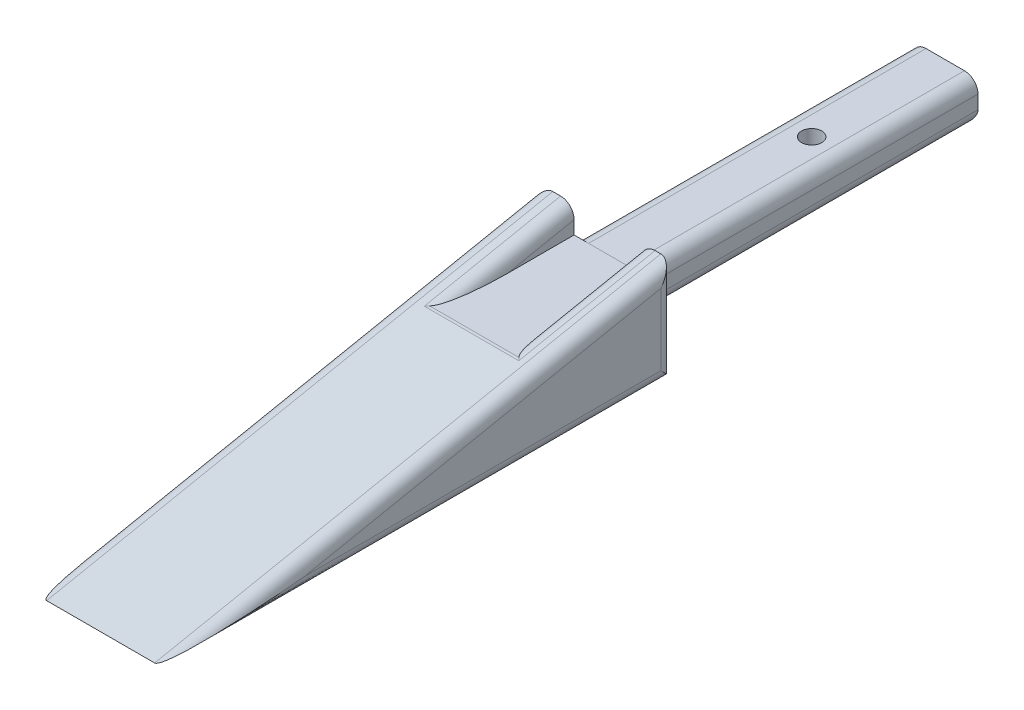
ISO-10303-21;
HEADER;
FILE_DESCRIPTION(('STEP AP214'),'2;1');
FILE_NAME('part.step','',(''),(''),'','','');
FILE_SCHEMA(('AUTOMOTIVE_DESIGN { 1 0 10303 214 1 1 1 1 }'));
ENDSEC;
DATA;
#1=APPLICATION_CONTEXT('core data for automotive mechanical design processes');
#2=APPLICATION_PROTOCOL_DEFINITION('international standard','automotive_design',2000,#1);
#3=PRODUCT_CONTEXT('',#1,'mechanical');
#4=PRODUCT('Part','Part','',(#3));
#5=PRODUCT_RELATED_PRODUCT_CATEGORY('part','',(#4));
#6=PRODUCT_DEFINITION_FORMATION('','',#4);
#7=PRODUCT_DEFINITION_CONTEXT('part definition',#1,'design');
#8=PRODUCT_DEFINITION('design','',#6,#7);
#9=PRODUCT_DEFINITION_SHAPE('','',#8);
#10=(LENGTH_UNIT() NAMED_UNIT(*) SI_UNIT(.MILLI.,.METRE.));
#11=(NAMED_UNIT(*) PLANE_ANGLE_UNIT() SI_UNIT($,.RADIAN.));
#12=(NAMED_UNIT(*) SI_UNIT($,.STERADIAN.) SOLID_ANGLE_UNIT());
#13=UNCERTAINTY_MEASURE_WITH_UNIT(LENGTH_MEASURE(1.E-05),#10,'distance_accuracy_value','');
#14=(GEOMETRIC_REPRESENTATION_CONTEXT(3) GLOBAL_UNCERTAINTY_ASSIGNED_CONTEXT((#13)) GLOBAL_UNIT_ASSIGNED_CONTEXT((#10,
#11,#12)) REPRESENTATION_CONTEXT('',''));
#15=CARTESIAN_POINT('',(0.,0.,0.));
#16=DIRECTION('',(0.,0.,1.));
#17=DIRECTION('',(1.,0.,0.));
#18=AXIS2_PLACEMENT_3D('',#15,#16,#17);
#19=CARTESIAN_POINT('',(-10.15,-8.,125.));
#20=DIRECTION('',(0.,0.98058067569092,0.196116135138184));
#21=DIRECTION('',(0.,-0.196116135138184,0.98058067569092));
#22=AXIS2_PLACEMENT_3D('',#19,#20,#21);
#23=PLANE('',#22);
#24=DIRECTION('',(1.,0.,0.));
#25=VECTOR('',#24,1.);
#26=CARTESIAN_POINT('',(-10.15,7.,50.));
#27=LINE('',#26,#25);
#28=CARTESIAN_POINT('',(-8.15,7.,50.));
#29=VERTEX_POINT('',#28);
#30=CARTESIAN_POINT('',(-7.,7.,50.));
#31=VERTEX_POINT('',#30);
#32=EDGE_CURVE('E163',#29,#31,#27,.T.);
#33=ORIENTED_EDGE('',*,*,#32,.F.);
#34=DIRECTION('',(0.,-0.196116135138184,0.98058067569092));
#35=VECTOR('',#34,1.);
#36=CARTESIAN_POINT('',(-8.15,-8.,125.));
#37=LINE('',#36,#35);
#38=CARTESIAN_POINT('',(-8.15,-8.,125.));
#39=VERTEX_POINT('',#38);
#40=EDGE_CURVE('E173',#29,#39,#37,.T.);
#41=ORIENTED_EDGE('',*,*,#40,.T.);
#42=DIRECTION('',(1.,0.,0.));
#43=VECTOR('',#42,1.);
#44=CARTESIAN_POINT('',(-10.15,-8.,125.));
#45=LINE('',#44,#43);
#46=CARTESIAN_POINT('',(7.85,-8.,125.));
#47=VERTEX_POINT('',#46);
#48=EDGE_CURVE('E245',#39,#47,#45,.T.);
#49=ORIENTED_EDGE('',*,*,#48,.T.);
#50=DIRECTION('',(0.,-0.196116135138184,0.98058067569092));
#51=VECTOR('',#50,1.);
#52=CARTESIAN_POINT('',(7.85,6.99999999999999,50.));
#53=LINE('',#52,#51);
#54=CARTESIAN_POINT('',(7.85,7.,50.));
#55=VERTEX_POINT('',#54);
#56=EDGE_CURVE('E147',#47,#55,#53,.F.);
#57=ORIENTED_EDGE('',*,*,#56,.T.);
#58=CARTESIAN_POINT('',(7.,7.,50.));
#59=VERTEX_POINT('',#58);
#60=EDGE_CURVE('E249',#59,#55,#27,.T.);
#61=ORIENTED_EDGE('',*,*,#60,.F.);
#62=DIRECTION('',(0.,-0.196116135138184,0.98058067569092));
#63=VECTOR('',#62,1.);
#64=CARTESIAN_POINT('',(7.,3.,70.));
#65=LINE('',#64,#63);
#66=CARTESIAN_POINT('',(7.,2.96116135138184,70.1941932430908));
#67=VERTEX_POINT('',#66);
#68=EDGE_CURVE('E168',#59,#67,#65,.T.);
#69=ORIENTED_EDGE('',*,*,#68,.T.);
#70=DIRECTION('',(-1.,0.,0.));
#71=VECTOR('',#70,1.);
#72=CARTESIAN_POINT('',(-5.,2.96116135138184,70.1941932430908));
#73=LINE('',#72,#71);
#74=CARTESIAN_POINT('',(-7.,2.96116135138184,70.1941932430908));
#75=VERTEX_POINT('',#74);
#76=EDGE_CURVE('E166',#67,#75,#73,.T.);
#77=ORIENTED_EDGE('',*,*,#76,.T.);
#78=DIRECTION('',(0.,0.196116135138184,-0.98058067569092));
#79=VECTOR('',#78,1.);
#80=CARTESIAN_POINT('',(-7.,7.,50.));
#81=LINE('',#80,#79);
#82=EDGE_CURVE('E171',#75,#31,#81,.T.);
#83=ORIENTED_EDGE('',*,*,#82,.T.);
#84=EDGE_LOOP('',(#33,#41,#49,#57,#61,#69,#77,#83));
#85=FACE_BOUND('',#84,.T.);
#86=ADVANCED_FACE('F47',(#85),#23,.T.);
#87=CARTESIAN_POINT('',(-10.15,7.,50.));
#88=DIRECTION('',(0.,0.,-1.));
#89=DIRECTION('',(-1.,0.,0.));
#90=AXIS2_PLACEMENT_3D('',#87,#88,#89);
#91=PLANE('',#90);
#92=DIRECTION('',(1.,0.,0.));
#93=VECTOR('',#92,1.);
#94=CARTESIAN_POINT('',(-10.15,-8.,50.));
#95=LINE('',#94,#93);
#96=CARTESIAN_POINT('',(-8.15,-8.,50.));
#97=VERTEX_POINT('',#96);
#98=CARTESIAN_POINT('',(7.85,-8.,50.));
#99=VERTEX_POINT('',#98);
#100=EDGE_CURVE('E242',#97,#99,#95,.T.);
#101=ORIENTED_EDGE('',*,*,#100,.F.);
#102=DIRECTION('',(0.,1.,0.));
#103=VECTOR('',#102,1.);
#104=CARTESIAN_POINT('',(-8.15,7.,50.));
#105=LINE('',#104,#103);
#106=EDGE_CURVE('E193',#97,#29,#105,.T.);
#107=ORIENTED_EDGE('',*,*,#106,.T.);
#108=ORIENTED_EDGE('',*,*,#32,.T.);
#109=CARTESIAN_POINT('',(-7.,4.96039219456289,50.));
#110=DIRECTION('',(0.,0.,-1.));
#111=DIRECTION('',(0.,-1.,0.));
#112=AXIS2_PLACEMENT_3D('',#109,#110,#111);
#113=ELLIPSE('',#112,2.03960780543711,2.);
#114=CARTESIAN_POINT('',(-5.,4.96039219456289,50.));
#115=VERTEX_POINT('',#114);
#116=EDGE_CURVE('E194',#31,#115,#113,.T.);
#117=ORIENTED_EDGE('',*,*,#116,.T.);
#118=DIRECTION('',(0.,1.,0.));
#119=VECTOR('',#118,1.);
#120=CARTESIAN_POINT('',(-5.,7.,50.));
#121=LINE('',#120,#119);
#122=CARTESIAN_POINT('',(-5.,3.,50.));
#123=VERTEX_POINT('',#122);
#124=EDGE_CURVE('E156',#123,#115,#121,.T.);
#125=ORIENTED_EDGE('',*,*,#124,.F.);
#126=DIRECTION('',(-1.,0.,0.));
#127=VECTOR('',#126,1.);
#128=CARTESIAN_POINT('',(-10.15,3.,50.));
#129=LINE('',#128,#127);
#130=CARTESIAN_POINT('',(5.,3.,50.));
#131=VERTEX_POINT('',#130);
#132=EDGE_CURVE('E150',#131,#123,#129,.T.);
#133=ORIENTED_EDGE('',*,*,#132,.F.);
#134=DIRECTION('',(0.,-1.,0.));
#135=VECTOR('',#134,1.);
#136=CARTESIAN_POINT('',(5.,7.,50.));
#137=LINE('',#136,#135);
#138=CARTESIAN_POINT('',(5.,4.96039219456289,50.));
#139=VERTEX_POINT('',#138);
#140=EDGE_CURVE('E139',#139,#131,#137,.T.);
#141=ORIENTED_EDGE('',*,*,#140,.F.);
#142=CARTESIAN_POINT('',(7.,4.96039219456289,50.));
#143=DIRECTION('',(0.,0.,-1.));
#144=DIRECTION('',(0.,1.,0.));
#145=AXIS2_PLACEMENT_3D('',#142,#143,#144);
#146=ELLIPSE('',#145,2.03960780543711,2.);
#147=EDGE_CURVE('E192',#139,#59,#146,.T.);
#148=ORIENTED_EDGE('',*,*,#147,.T.);
#149=ORIENTED_EDGE('',*,*,#60,.T.);
#150=DIRECTION('',(0.,1.,0.));
#151=VECTOR('',#150,1.);
#152=CARTESIAN_POINT('',(7.85,-8.,50.));
#153=LINE('',#152,#151);
#154=EDGE_CURVE('E186',#55,#99,#153,.F.);
#155=ORIENTED_EDGE('',*,*,#154,.T.);
#156=EDGE_LOOP('',(#101,#107,#108,#117,#125,#133,#141,#148,#149,#155));
#157=FACE_BOUND('',#156,.T.);
#158=ADVANCED_FACE('F159',(#157),#91,.T.);
#159=CARTESIAN_POINT('',(-10.15,-8.,125.));
#160=DIRECTION('',(0.,-1.,0.));
#161=DIRECTION('',(0.,0.,-1.));
#162=AXIS2_PLACEMENT_3D('',#159,#160,#161);
#163=PLANE('',#162);
#164=ORIENTED_EDGE('',*,*,#48,.F.);
#165=DIRECTION('',(0.,0.,-1.));
#166=VECTOR('',#165,1.);
#167=CARTESIAN_POINT('',(-8.15,-8.,125.));
#168=LINE('',#167,#166);
#169=EDGE_CURVE('E177',#39,#97,#168,.T.);
#170=ORIENTED_EDGE('',*,*,#169,.T.);
#171=ORIENTED_EDGE('',*,*,#100,.T.);
#172=DIRECTION('',(0.,0.,-1.));
#173=VECTOR('',#172,1.);
#174=CARTESIAN_POINT('',(7.85,-8.,125.));
#175=LINE('',#174,#173);
#176=EDGE_CURVE('E176',#99,#47,#175,.F.);
#177=ORIENTED_EDGE('',*,*,#176,.T.);
#178=EDGE_LOOP('',(#164,#170,#171,#177));
#179=FACE_BOUND('',#178,.T.);
#180=ADVANCED_FACE('F241',(#179),#163,.T.);
#181=CARTESIAN_POINT('',(-10.15,0.,0.));
#182=DIRECTION('',(-1.,0.,0.));
#183=DIRECTION('',(0.,0.,1.));
#184=AXIS2_PLACEMENT_3D('',#181,#182,#183);
#185=PLANE('',#184);
#186=DIRECTION('',(0.,1.,0.));
#187=VECTOR('',#186,1.);
#188=CARTESIAN_POINT('',(-10.15,0.,52.));
#189=LINE('',#188,#187);
#190=CARTESIAN_POINT('',(-10.15,4.56039219456289,52.));
#191=VERTEX_POINT('',#190);
#192=CARTESIAN_POINT('',(-10.15,-6.,52.));
#193=VERTEX_POINT('',#192);
#194=EDGE_CURVE('E183',#191,#193,#189,.F.);
#195=ORIENTED_EDGE('',*,*,#194,.T.);
#196=DIRECTION('',(0.,0.,-1.));
#197=VECTOR('',#196,1.);
#198=CARTESIAN_POINT('',(-10.15,-6.,0.));
#199=LINE('',#198,#197);
#200=CARTESIAN_POINT('',(-10.15,-6.,104.801960972814));
#201=VERTEX_POINT('',#200);
#202=EDGE_CURVE('E187',#193,#201,#199,.F.);
#203=ORIENTED_EDGE('',*,*,#202,.T.);
#204=DIRECTION('',(0.,-0.196116135138184,0.98058067569092));
#205=VECTOR('',#204,1.);
#206=CARTESIAN_POINT('',(-10.15,14.384992494772,2.8769984989544));
#207=LINE('',#206,#205);
#208=EDGE_CURVE('E185',#201,#191,#207,.F.);
#209=ORIENTED_EDGE('',*,*,#208,.T.);
#210=EDGE_LOOP('',(#195,#203,#209));
#211=FACE_BOUND('',#210,.T.);
#212=ADVANCED_FACE('F322',(#211),#185,.T.);
#213=CARTESIAN_POINT('',(9.85,0.,0.));
#214=DIRECTION('',(-1.,0.,0.));
#215=DIRECTION('',(0.,0.,1.));
#216=AXIS2_PLACEMENT_3D('',#213,#214,#215);
#217=PLANE('',#216);
#218=DIRECTION('',(0.,-0.196116135138184,0.98058067569092));
#219=VECTOR('',#218,1.);
#220=CARTESIAN_POINT('',(9.85,-9.96116135138185,124.607767729724));
#221=LINE('',#220,#219);
#222=CARTESIAN_POINT('',(9.85,4.56039219456289,52.));
#223=VERTEX_POINT('',#222);
#224=CARTESIAN_POINT('',(9.85,-6.,104.801960972814));
#225=VERTEX_POINT('',#224);
#226=EDGE_CURVE('E198',#223,#225,#221,.T.);
#227=ORIENTED_EDGE('',*,*,#226,.T.);
#228=DIRECTION('',(0.,0.,-1.));
#229=VECTOR('',#228,1.);
#230=CARTESIAN_POINT('',(9.85,-6.,50.));
#231=LINE('',#230,#229);
#232=CARTESIAN_POINT('',(9.85,-6.,52.));
#233=VERTEX_POINT('',#232);
#234=EDGE_CURVE('E201',#225,#233,#231,.T.);
#235=ORIENTED_EDGE('',*,*,#234,.T.);
#236=DIRECTION('',(0.,1.,0.));
#237=VECTOR('',#236,1.);
#238=CARTESIAN_POINT('',(9.85,7.,52.));
#239=LINE('',#238,#237);
#240=EDGE_CURVE('E204',#233,#223,#239,.T.);
#241=ORIENTED_EDGE('',*,*,#240,.T.);
#242=EDGE_LOOP('',(#227,#235,#241));
#243=FACE_BOUND('',#242,.T.);
#244=ADVANCED_FACE('F232',(#243),#217,.F.);
#245=CARTESIAN_POINT('',(5.,3.,92.8442252426265));
#246=DIRECTION('',(1.,0.,0.));
#247=DIRECTION('',(0.,0.,-1.));
#248=AXIS2_PLACEMENT_3D('',#245,#246,#247);
#249=PLANE('',#248);
#250=DIRECTION('',(0.,0.,-1.));
#251=VECTOR('',#250,1.);
#252=CARTESIAN_POINT('',(5.,3.,92.8442252426265));
#253=LINE('',#252,#251);
#254=CARTESIAN_POINT('',(5.,3.,59.8019609728144));
#255=VERTEX_POINT('',#254);
#256=EDGE_CURVE('E138',#255,#131,#253,.T.);
#257=ORIENTED_EDGE('',*,*,#256,.F.);
#258=DIRECTION('',(0.,-0.196116135138184,0.98058067569092));
#259=VECTOR('',#258,1.);
#260=CARTESIAN_POINT('',(5.,5.03883864861816,49.6077677297236));
#261=LINE('',#260,#259);
#262=EDGE_CURVE('E145',#255,#139,#261,.F.);
#263=ORIENTED_EDGE('',*,*,#262,.T.);
#264=ORIENTED_EDGE('',*,*,#140,.T.);
#265=EDGE_LOOP('',(#257,#263,#264));
#266=FACE_BOUND('',#265,.T.);
#267=ADVANCED_FACE('F136',(#266),#249,.F.);
#268=CARTESIAN_POINT('',(5.,3.,92.8442252426265));
#269=DIRECTION('',(0.,-1.,0.));
#270=DIRECTION('',(0.,0.,-1.));
#271=AXIS2_PLACEMENT_3D('',#268,#269,#270);
#272=PLANE('',#271);
#273=DIRECTION('',(0.,0.,-1.));
#274=VECTOR('',#273,1.);
#275=CARTESIAN_POINT('',(-5.,3.,92.8442252426265));
#276=LINE('',#275,#274);
#277=CARTESIAN_POINT('',(-5.,3.,59.8019609728144));
#278=VERTEX_POINT('',#277);
#279=EDGE_CURVE('E155',#278,#123,#276,.T.);
#280=ORIENTED_EDGE('',*,*,#279,.F.);
#281=CARTESIAN_POINT('',(-7.,3.,59.8019609728144));
#282=DIRECTION('',(0.,-1.,0.));
#283=DIRECTION('',(0.,0.,1.));
#284=AXIS2_PLACEMENT_3D('',#281,#282,#283);
#285=ELLIPSE('',#284,10.1980390271856,2.);
#286=CARTESIAN_POINT('',(-6.60776772972362,3.,69.8019609728144));
#287=VERTEX_POINT('',#286);
#288=EDGE_CURVE('E59',#278,#287,#285,.T.);
#289=ORIENTED_EDGE('',*,*,#288,.T.);
#290=DIRECTION('',(-1.,0.,0.));
#291=VECTOR('',#290,1.);
#292=CARTESIAN_POINT('',(5.,3.,69.8019609728144));
#293=LINE('',#292,#291);
#294=CARTESIAN_POINT('',(6.60776772972362,3.,69.8019609728144));
#295=VERTEX_POINT('',#294);
#296=EDGE_CURVE('E63',#287,#295,#293,.F.);
#297=ORIENTED_EDGE('',*,*,#296,.T.);
#298=CARTESIAN_POINT('',(7.,3.,59.8019609728144));
#299=DIRECTION('',(0.,-1.,0.));
#300=DIRECTION('',(0.,0.,-1.));
#301=AXIS2_PLACEMENT_3D('',#298,#299,#300);
#302=ELLIPSE('',#301,10.1980390271856,2.);
#303=EDGE_CURVE('E12',#295,#255,#302,.T.);
#304=ORIENTED_EDGE('',*,*,#303,.T.);
#305=ORIENTED_EDGE('',*,*,#256,.T.);
#306=ORIENTED_EDGE('',*,*,#132,.T.);
#307=EDGE_LOOP('',(#280,#289,#297,#304,#305,#306));
#308=FACE_BOUND('',#307,.T.);
#309=ADVANCED_FACE('F152',(#308),#272,.F.);
#310=CARTESIAN_POINT('',(-5.,3.,92.8442252426265));
#311=DIRECTION('',(-1.,0.,0.));
#312=DIRECTION('',(0.,0.,1.));
#313=AXIS2_PLACEMENT_3D('',#310,#311,#312);
#314=PLANE('',#313);
#315=ORIENTED_EDGE('',*,*,#124,.T.);
#316=DIRECTION('',(0.,0.196116135138184,-0.98058067569092));
#317=VECTOR('',#316,1.);
#318=CARTESIAN_POINT('',(-5.,1.03883864861816,69.6077677297236));
#319=LINE('',#318,#317);
#320=EDGE_CURVE('E199',#115,#278,#319,.F.);
#321=ORIENTED_EDGE('',*,*,#320,.T.);
#322=ORIENTED_EDGE('',*,*,#279,.T.);
#323=EDGE_LOOP('',(#315,#321,#322));
#324=FACE_BOUND('',#323,.T.);
#325=ADVANCED_FACE('F261',(#324),#314,.F.);
#326=CARTESIAN_POINT('',(7.,-9.96116135138184,124.607767729724));
#327=DIRECTION('',(0.,0.196116135138184,-0.98058067569092));
#328=DIRECTION('',(0.,0.98058067569092,0.196116135138184));
#329=AXIS2_PLACEMENT_3D('',#326,#327,#328);
#330=CYLINDRICAL_SURFACE('',#329,2.);
#331=ORIENTED_EDGE('',*,*,#262,.F.);
#332=ORIENTED_EDGE('',*,*,#303,.F.);
#333=CARTESIAN_POINT('',(7.,1.,69.8019609728144));
#334=DIRECTION('',(0.707106781186547,0.138675049056307,-0.693375245281536));
#335=DIRECTION('',(0.707106781186547,-0.138675049056307,0.693375245281536));
#336=AXIS2_PLACEMENT_3D('',#333,#334,#335);
#337=ELLIPSE('',#336,2.82842712474619,2.);
#338=EDGE_CURVE('E151',#67,#295,#337,.F.);
#339=ORIENTED_EDGE('',*,*,#338,.F.);
#340=ORIENTED_EDGE('',*,*,#68,.F.);
#341=ORIENTED_EDGE('',*,*,#147,.F.);
#342=EDGE_LOOP('',(#331,#332,#339,#340,#341));
#343=FACE_BOUND('',#342,.T.);
#344=ADVANCED_FACE('F268',(#343),#330,.T.);
#345=CARTESIAN_POINT('',(-7.,-9.96116135138184,124.607767729724));
#346=DIRECTION('',(0.,-0.196116135138184,0.98058067569092));
#347=DIRECTION('',(0.,-0.98058067569092,-0.196116135138184));
#348=AXIS2_PLACEMENT_3D('',#345,#346,#347);
#349=CYLINDRICAL_SURFACE('',#348,2.);
#350=ORIENTED_EDGE('',*,*,#116,.F.);
#351=ORIENTED_EDGE('',*,*,#82,.F.);
#352=CARTESIAN_POINT('',(-7.,1.,69.8019609728144));
#353=DIRECTION('',(0.707106781186547,-0.138675049056307,0.693375245281536));
#354=DIRECTION('',(0.707106781186547,0.138675049056307,-0.693375245281536));
#355=AXIS2_PLACEMENT_3D('',#352,#353,#354);
#356=ELLIPSE('',#355,2.82842712474619,2.);
#357=EDGE_CURVE('E206',#287,#75,#356,.T.);
#358=ORIENTED_EDGE('',*,*,#357,.F.);
#359=ORIENTED_EDGE('',*,*,#288,.F.);
#360=ORIENTED_EDGE('',*,*,#320,.F.);
#361=EDGE_LOOP('',(#350,#351,#358,#359,#360));
#362=FACE_BOUND('',#361,.T.);
#363=ADVANCED_FACE('F258',(#362),#349,.T.);
#364=CARTESIAN_POINT('',(-10.15,0.999999999999999,69.8019609728144));
#365=DIRECTION('',(1.,0.,0.));
#366=DIRECTION('',(0.,0.,-1.));
#367=AXIS2_PLACEMENT_3D('',#364,#365,#366);
#368=CYLINDRICAL_SURFACE('',#367,2.);
#369=ORIENTED_EDGE('',*,*,#338,.T.);
#370=ORIENTED_EDGE('',*,*,#296,.F.);
#371=ORIENTED_EDGE('',*,*,#357,.T.);
#372=ORIENTED_EDGE('',*,*,#76,.F.);
#373=EDGE_LOOP('',(#369,#370,#371,#372));
#374=FACE_BOUND('',#373,.T.);
#375=ADVANCED_FACE('F267',(#374),#368,.T.);
#376=CARTESIAN_POINT('',(-8.15,-9.96116135138184,124.607767729724));
#377=DIRECTION('',(0.,-0.196116135138184,0.98058067569092));
#378=DIRECTION('',(0.,-0.98058067569092,-0.196116135138184));
#379=AXIS2_PLACEMENT_3D('',#376,#377,#378);
#380=CYLINDRICAL_SURFACE('',#379,2.);
#381=CARTESIAN_POINT('',(-8.15,-6.,104.801960972814));
#382=DIRECTION('',(0.,-0.99513332666807,-0.0985376179666413));
#383=DIRECTION('',(0.,-0.0985376179666422,0.99513332666807));
#384=AXIS2_PLACEMENT_3D('',#381,#382,#383);
#385=ELLIPSE('',#384,20.2968170052281,2.);
#386=EDGE_CURVE('E211',#39,#201,#385,.T.);
#387=ORIENTED_EDGE('',*,*,#386,.F.);
#388=ORIENTED_EDGE('',*,*,#40,.F.);
#389=CARTESIAN_POINT('',(-8.15,4.56039219456289,52.));
#390=DIRECTION('',(0.,0.633988905605538,0.773342141337902));
#391=DIRECTION('',(0.,-0.773342141337902,0.633988905605538));
#392=AXIS2_PLACEMENT_3D('',#389,#390,#391);
#393=ELLIPSE('',#392,3.15462933549248,2.);
#394=EDGE_CURVE('E208',#191,#29,#393,.F.);
#395=ORIENTED_EDGE('',*,*,#394,.F.);
#396=ORIENTED_EDGE('',*,*,#208,.F.);
#397=EDGE_LOOP('',(#387,#388,#395,#396));
#398=FACE_BOUND('',#397,.T.);
#399=ADVANCED_FACE('F286',(#398),#380,.T.);
#400=CARTESIAN_POINT('',(-8.15,7.,52.));
#401=DIRECTION('',(0.,1.,0.));
#402=DIRECTION('',(0.,0.,1.));
#403=AXIS2_PLACEMENT_3D('',#400,#401,#402);
#404=CYLINDRICAL_SURFACE('',#403,2.);
#405=ORIENTED_EDGE('',*,*,#394,.T.);
#406=ORIENTED_EDGE('',*,*,#106,.F.);
#407=CARTESIAN_POINT('',(-8.15,-6.,52.));
#408=DIRECTION('',(0.,0.707106781186547,-0.707106781186547));
#409=DIRECTION('',(0.,0.707106781186547,0.707106781186547));
#410=AXIS2_PLACEMENT_3D('',#407,#408,#409);
#411=ELLIPSE('',#410,2.82842712474619,2.);
#412=EDGE_CURVE('E215',#193,#97,#411,.F.);
#413=ORIENTED_EDGE('',*,*,#412,.F.);
#414=ORIENTED_EDGE('',*,*,#194,.F.);
#415=EDGE_LOOP('',(#405,#406,#413,#414));
#416=FACE_BOUND('',#415,.T.);
#417=ADVANCED_FACE('F291',(#416),#404,.T.);
#418=CARTESIAN_POINT('',(-8.15,-6.,125.));
#419=DIRECTION('',(0.,0.,-1.));
#420=DIRECTION('',(-1.,0.,0.));
#421=AXIS2_PLACEMENT_3D('',#418,#419,#420);
#422=CYLINDRICAL_SURFACE('',#421,2.);
#423=ORIENTED_EDGE('',*,*,#386,.T.);
#424=ORIENTED_EDGE('',*,*,#202,.F.);
#425=ORIENTED_EDGE('',*,*,#412,.T.);
#426=ORIENTED_EDGE('',*,*,#169,.F.);
#427=EDGE_LOOP('',(#423,#424,#425,#426));
#428=FACE_BOUND('',#427,.T.);
#429=ADVANCED_FACE('F299',(#428),#422,.T.);
#430=CARTESIAN_POINT('',(7.85,14.384992494772,2.8769984989544));
#431=DIRECTION('',(0.,0.196116135138184,-0.98058067569092));
#432=DIRECTION('',(0.,0.98058067569092,0.196116135138184));
#433=AXIS2_PLACEMENT_3D('',#430,#431,#432);
#434=CYLINDRICAL_SURFACE('',#433,2.);
#435=CARTESIAN_POINT('',(7.85,-6.,104.801960972814));
#436=DIRECTION('',(0.,0.99513332666807,0.0985376179666413));
#437=DIRECTION('',(0.,0.0985376179666422,-0.99513332666807));
#438=AXIS2_PLACEMENT_3D('',#435,#436,#437);
#439=ELLIPSE('',#438,20.2968170052281,2.);
#440=EDGE_CURVE('E216',#225,#47,#439,.F.);
#441=ORIENTED_EDGE('',*,*,#440,.F.);
#442=ORIENTED_EDGE('',*,*,#226,.F.);
#443=CARTESIAN_POINT('',(7.85,4.56039219456289,52.));
#444=DIRECTION('',(0.,-0.633988905605538,-0.773342141337902));
#445=DIRECTION('',(0.,0.773342141337902,-0.633988905605538));
#446=AXIS2_PLACEMENT_3D('',#443,#444,#445);
#447=ELLIPSE('',#446,3.15462933549248,2.);
#448=EDGE_CURVE('E52',#55,#223,#447,.T.);
#449=ORIENTED_EDGE('',*,*,#448,.F.);
#450=ORIENTED_EDGE('',*,*,#56,.F.);
#451=EDGE_LOOP('',(#441,#442,#449,#450));
#452=FACE_BOUND('',#451,.T.);
#453=ADVANCED_FACE('F51',(#452),#434,.T.);
#454=CARTESIAN_POINT('',(7.85,0.,52.));
#455=DIRECTION('',(0.,-1.,0.));
#456=DIRECTION('',(0.,0.,-1.));
#457=AXIS2_PLACEMENT_3D('',#454,#455,#456);
#458=CYLINDRICAL_SURFACE('',#457,2.);
#459=ORIENTED_EDGE('',*,*,#448,.T.);
#460=ORIENTED_EDGE('',*,*,#240,.F.);
#461=CARTESIAN_POINT('',(7.85,-6.,52.));
#462=DIRECTION('',(0.,-0.707106781186547,0.707106781186547));
#463=DIRECTION('',(0.,-0.707106781186547,-0.707106781186547));
#464=AXIS2_PLACEMENT_3D('',#461,#462,#463);
#465=ELLIPSE('',#464,2.82842712474619,2.);
#466=EDGE_CURVE('E220',#99,#233,#465,.T.);
#467=ORIENTED_EDGE('',*,*,#466,.F.);
#468=ORIENTED_EDGE('',*,*,#154,.F.);
#469=EDGE_LOOP('',(#459,#460,#467,#468));
#470=FACE_BOUND('',#469,.T.);
#471=ADVANCED_FACE('F229',(#470),#458,.T.);
#472=CARTESIAN_POINT('',(7.85,-6.,0.));
#473=DIRECTION('',(0.,0.,1.));
#474=DIRECTION('',(1.,0.,0.));
#475=AXIS2_PLACEMENT_3D('',#472,#473,#474);
#476=CYLINDRICAL_SURFACE('',#475,2.);
#477=ORIENTED_EDGE('',*,*,#440,.T.);
#478=ORIENTED_EDGE('',*,*,#176,.F.);
#479=ORIENTED_EDGE('',*,*,#466,.T.);
#480=ORIENTED_EDGE('',*,*,#234,.F.);
#481=EDGE_LOOP('',(#477,#478,#479,#480));
#482=FACE_BOUND('',#481,.T.);
#483=ADVANCED_FACE('F236',(#482),#476,.T.);
#484=CLOSED_SHELL('',(#86,#158,#180,#212,#244,#267,#309,#325,#344,#363,#375,#399,#417,#429,#453,
#471,#483));
#485=MANIFOLD_SOLID_BREP('B2',#484);
#486=CARTESIAN_POINT('',(4.85,-3.,50.));
#487=DIRECTION('',(-1.,0.,0.));
#488=DIRECTION('',(0.,0.,1.));
#489=AXIS2_PLACEMENT_3D('',#486,#487,#488);
#490=PLANE('',#489);
#491=DIRECTION('',(0.,1.,0.));
#492=VECTOR('',#491,1.);
#493=CARTESIAN_POINT('',(4.85,-3.,50.));
#494=LINE('',#493,#492);
#495=CARTESIAN_POINT('',(4.85,-1.,50.));
#496=VERTEX_POINT('',#495);
#497=CARTESIAN_POINT('',(4.85,1.,50.));
#498=VERTEX_POINT('',#497);
#499=EDGE_CURVE('E555',#496,#498,#494,.T.);
#500=ORIENTED_EDGE('',*,*,#499,.F.);
#501=DIRECTION('',(0.,0.,-1.));
#502=VECTOR('',#501,1.);
#503=CARTESIAN_POINT('',(4.85,-1.,50.));
#504=LINE('',#503,#502);
#505=CARTESIAN_POINT('',(4.85,-1.,0.));
#506=VERTEX_POINT('',#505);
#507=EDGE_CURVE('E50',#496,#506,#504,.T.);
#508=ORIENTED_EDGE('',*,*,#507,.T.);
#509=DIRECTION('',(0.,1.,0.));
#510=VECTOR('',#509,1.);
#511=CARTESIAN_POINT('',(4.85,-3.,0.));
#512=LINE('',#511,#510);
#513=CARTESIAN_POINT('',(4.85,1.,0.));
#514=VERTEX_POINT('',#513);
#515=EDGE_CURVE('E538',#506,#514,#512,.T.);
#516=ORIENTED_EDGE('',*,*,#515,.T.);
#517=DIRECTION('',(0.,0.,-1.));
#518=VECTOR('',#517,1.);
#519=CARTESIAN_POINT('',(4.85,1.,50.));
#520=LINE('',#519,#518);
#521=EDGE_CURVE('E431',#514,#498,#520,.F.);
#522=ORIENTED_EDGE('',*,*,#521,.T.);
#523=EDGE_LOOP('',(#500,#508,#516,#522));
#524=FACE_BOUND('',#523,.T.);
#525=ADVANCED_FACE('F422',(#524),#490,.F.);
#526=CARTESIAN_POINT('',(-4.85,3.,50.));
#527=DIRECTION('',(0.,-1.,0.));
#528=DIRECTION('',(0.,0.,-1.));
#529=AXIS2_PLACEMENT_3D('',#526,#527,#528);
#530=PLANE('',#529);
#531=CARTESIAN_POINT('',(0.,3.,19.8));
#532=DIRECTION('',(0.,1.,0.));
#533=DIRECTION('',(0.,0.,1.));
#534=AXIS2_PLACEMENT_3D('',#531,#532,#533);
#535=CIRCLE('',#534,1.5);
#536=CARTESIAN_POINT('',(0.,3.,21.3));
#537=VERTEX_POINT('',#536);
#538=EDGE_CURVE('E565',#537,#537,#535,.T.);
#539=ORIENTED_EDGE('',*,*,#538,.F.);
#540=EDGE_LOOP('',(#539));
#541=FACE_BOUND('',#540,.T.);
#542=DIRECTION('',(-1.,0.,0.));
#543=VECTOR('',#542,1.);
#544=CARTESIAN_POINT('',(-4.85,3.,0.));
#545=LINE('',#544,#543);
#546=CARTESIAN_POINT('',(2.85,3.,0.));
#547=VERTEX_POINT('',#546);
#548=CARTESIAN_POINT('',(-2.85,3.,0.));
#549=VERTEX_POINT('',#548);
#550=EDGE_CURVE('E541',#547,#549,#545,.T.);
#551=ORIENTED_EDGE('',*,*,#550,.T.);
#552=DIRECTION('',(0.,0.,-1.));
#553=VECTOR('',#552,1.);
#554=CARTESIAN_POINT('',(-2.85,3.,50.));
#555=LINE('',#554,#553);
#556=CARTESIAN_POINT('',(-2.85,3.,50.));
#557=VERTEX_POINT('',#556);
#558=EDGE_CURVE('E437',#549,#557,#555,.F.);
#559=ORIENTED_EDGE('',*,*,#558,.T.);
#560=DIRECTION('',(-1.,0.,0.));
#561=VECTOR('',#560,1.);
#562=CARTESIAN_POINT('',(-4.85,3.,50.));
#563=LINE('',#562,#561);
#564=CARTESIAN_POINT('',(2.85,3.,50.));
#565=VERTEX_POINT('',#564);
#566=EDGE_CURVE('E560',#565,#557,#563,.T.);
#567=ORIENTED_EDGE('',*,*,#566,.F.);
#568=DIRECTION('',(0.,0.,-1.));
#569=VECTOR('',#568,1.);
#570=CARTESIAN_POINT('',(2.85,3.,50.));
#571=LINE('',#570,#569);
#572=EDGE_CURVE('E499',#565,#547,#571,.T.);
#573=ORIENTED_EDGE('',*,*,#572,.T.);
#574=EDGE_LOOP('',(#551,#559,#567,#573));
#575=FACE_BOUND('',#574,.T.);
#576=ADVANCED_FACE('F582',(#541,#575),#530,.F.);
#577=CARTESIAN_POINT('',(-4.85,-3.,50.));
#578=DIRECTION('',(1.,0.,0.));
#579=DIRECTION('',(0.,0.,-1.));
#580=AXIS2_PLACEMENT_3D('',#577,#578,#579);
#581=PLANE('',#580);
#582=DIRECTION('',(0.,-1.,0.));
#583=VECTOR('',#582,1.);
#584=CARTESIAN_POINT('',(-4.85,-3.,0.));
#585=LINE('',#584,#583);
#586=CARTESIAN_POINT('',(-4.85,1.,0.));
#587=VERTEX_POINT('',#586);
#588=CARTESIAN_POINT('',(-4.85,-1.,0.));
#589=VERTEX_POINT('',#588);
#590=EDGE_CURVE('E546',#587,#589,#585,.T.);
#591=ORIENTED_EDGE('',*,*,#590,.T.);
#592=DIRECTION('',(0.,0.,-1.));
#593=VECTOR('',#592,1.);
#594=CARTESIAN_POINT('',(-4.85,-1.,50.));
#595=LINE('',#594,#593);
#596=CARTESIAN_POINT('',(-4.85,-1.,50.));
#597=VERTEX_POINT('',#596);
#598=EDGE_CURVE('E526',#589,#597,#595,.F.);
#599=ORIENTED_EDGE('',*,*,#598,.T.);
#600=DIRECTION('',(0.,-1.,0.));
#601=VECTOR('',#600,1.);
#602=CARTESIAN_POINT('',(-4.85,-3.,50.));
#603=LINE('',#602,#601);
#604=CARTESIAN_POINT('',(-4.85,1.,50.));
#605=VERTEX_POINT('',#604);
#606=EDGE_CURVE('E496',#605,#597,#603,.T.);
#607=ORIENTED_EDGE('',*,*,#606,.F.);
#608=DIRECTION('',(0.,0.,-1.));
#609=VECTOR('',#608,1.);
#610=CARTESIAN_POINT('',(-4.85,1.,50.));
#611=LINE('',#610,#609);
#612=EDGE_CURVE('E527',#605,#587,#611,.T.);
#613=ORIENTED_EDGE('',*,*,#612,.T.);
#614=EDGE_LOOP('',(#591,#599,#607,#613));
#615=FACE_BOUND('',#614,.T.);
#616=ADVANCED_FACE('F589',(#615),#581,.F.);
#617=CARTESIAN_POINT('',(-4.85,-3.,50.));
#618=DIRECTION('',(0.,1.,0.));
#619=DIRECTION('',(0.,0.,1.));
#620=AXIS2_PLACEMENT_3D('',#617,#618,#619);
#621=PLANE('',#620);
#622=CARTESIAN_POINT('',(0.,-3.,19.8));
#623=DIRECTION('',(0.,1.,0.));
#624=DIRECTION('',(0.,0.,1.));
#625=AXIS2_PLACEMENT_3D('',#622,#623,#624);
#626=CIRCLE('',#625,1.5);
#627=CARTESIAN_POINT('',(0.,-3.,21.3));
#628=VERTEX_POINT('',#627);
#629=EDGE_CURVE('E428',#628,#628,#626,.T.);
#630=ORIENTED_EDGE('',*,*,#629,.T.);
#631=EDGE_LOOP('',(#630));
#632=FACE_BOUND('',#631,.T.);
#633=DIRECTION('',(1.,0.,0.));
#634=VECTOR('',#633,1.);
#635=CARTESIAN_POINT('',(-4.85,-3.,50.));
#636=LINE('',#635,#634);
#637=CARTESIAN_POINT('',(-2.85,-3.,50.));
#638=VERTEX_POINT('',#637);
#639=CARTESIAN_POINT('',(2.85,-3.,50.));
#640=VERTEX_POINT('',#639);
#641=EDGE_CURVE('E491',#638,#640,#636,.T.);
#642=ORIENTED_EDGE('',*,*,#641,.F.);
#643=DIRECTION('',(0.,0.,-1.));
#644=VECTOR('',#643,1.);
#645=CARTESIAN_POINT('',(-2.85,-3.,50.));
#646=LINE('',#645,#644);
#647=CARTESIAN_POINT('',(-2.85,-3.,2.));
#648=VERTEX_POINT('',#647);
#649=EDGE_CURVE('E506',#638,#648,#646,.T.);
#650=ORIENTED_EDGE('',*,*,#649,.T.);
#651=DIRECTION('',(1.,0.,0.));
#652=VECTOR('',#651,1.);
#653=CARTESIAN_POINT('',(4.85,-3.,2.));
#654=LINE('',#653,#652);
#655=CARTESIAN_POINT('',(2.85,-3.,2.));
#656=VERTEX_POINT('',#655);
#657=EDGE_CURVE('E517',#648,#656,#654,.T.);
#658=ORIENTED_EDGE('',*,*,#657,.T.);
#659=DIRECTION('',(0.,0.,-1.));
#660=VECTOR('',#659,1.);
#661=CARTESIAN_POINT('',(2.85,-3.,50.));
#662=LINE('',#661,#660);
#663=EDGE_CURVE('E508',#656,#640,#662,.F.);
#664=ORIENTED_EDGE('',*,*,#663,.T.);
#665=EDGE_LOOP('',(#642,#650,#658,#664));
#666=FACE_BOUND('',#665,.T.);
#667=ADVANCED_FACE('F502',(#632,#666),#621,.F.);
#668=CARTESIAN_POINT('',(0.,0.,50.));
#669=DIRECTION('',(0.,0.,-1.));
#670=DIRECTION('',(-1.,0.,0.));
#671=AXIS2_PLACEMENT_3D('',#668,#669,#670);
#672=PLANE('',#671);
#673=ORIENTED_EDGE('',*,*,#606,.T.);
#674=CARTESIAN_POINT('',(-2.85,-1.,50.));
#675=DIRECTION('',(0.,0.,-1.));
#676=DIRECTION('',(-1.,0.,0.));
#677=AXIS2_PLACEMENT_3D('',#674,#675,#676);
#678=CIRCLE('',#677,2.);
#679=EDGE_CURVE('E489',#597,#638,#678,.F.);
#680=ORIENTED_EDGE('',*,*,#679,.T.);
#681=ORIENTED_EDGE('',*,*,#641,.T.);
#682=CARTESIAN_POINT('',(2.85,-1.,50.));
#683=DIRECTION('',(0.,0.,-1.));
#684=DIRECTION('',(-1.,0.,0.));
#685=AXIS2_PLACEMENT_3D('',#682,#683,#684);
#686=CIRCLE('',#685,2.);
#687=EDGE_CURVE('E535',#640,#496,#686,.F.);
#688=ORIENTED_EDGE('',*,*,#687,.T.);
#689=ORIENTED_EDGE('',*,*,#499,.T.);
#690=CARTESIAN_POINT('',(2.85,1.,50.));
#691=DIRECTION('',(0.,0.,-1.));
#692=DIRECTION('',(-1.,0.,0.));
#693=AXIS2_PLACEMENT_3D('',#690,#691,#692);
#694=CIRCLE('',#693,2.);
#695=EDGE_CURVE('E447',#498,#565,#694,.F.);
#696=ORIENTED_EDGE('',*,*,#695,.T.);
#697=ORIENTED_EDGE('',*,*,#566,.T.);
#698=CARTESIAN_POINT('',(-2.85,1.,50.));
#699=DIRECTION('',(0.,0.,-1.));
#700=DIRECTION('',(-1.,0.,0.));
#701=AXIS2_PLACEMENT_3D('',#698,#699,#700);
#702=CIRCLE('',#701,2.);
#703=EDGE_CURVE('E501',#557,#605,#702,.F.);
#704=ORIENTED_EDGE('',*,*,#703,.T.);
#705=EDGE_LOOP('',(#673,#680,#681,#688,#689,#696,#697,#704));
#706=FACE_BOUND('',#705,.T.);
#707=ADVANCED_FACE('F495',(#706),#672,.F.);
#708=CARTESIAN_POINT('',(0.,0.,0.));
#709=DIRECTION('',(0.,0.,-1.));
#710=DIRECTION('',(-1.,0.,0.));
#711=AXIS2_PLACEMENT_3D('',#708,#709,#710);
#712=PLANE('',#711);
#713=ORIENTED_EDGE('',*,*,#515,.F.);
#714=DIRECTION('',(1.,0.,0.));
#715=VECTOR('',#714,1.);
#716=CARTESIAN_POINT('',(-4.85,-1.,0.));
#717=LINE('',#716,#715);
#718=EDGE_CURVE('E521',#506,#589,#717,.F.);
#719=ORIENTED_EDGE('',*,*,#718,.T.);
#720=ORIENTED_EDGE('',*,*,#590,.F.);
#721=CARTESIAN_POINT('',(-2.85,1.,0.));
#722=DIRECTION('',(0.,0.,-1.));
#723=DIRECTION('',(-1.,0.,0.));
#724=AXIS2_PLACEMENT_3D('',#721,#722,#723);
#725=CIRCLE('',#724,2.);
#726=EDGE_CURVE('E519',#587,#549,#725,.T.);
#727=ORIENTED_EDGE('',*,*,#726,.T.);
#728=ORIENTED_EDGE('',*,*,#550,.F.);
#729=CARTESIAN_POINT('',(2.85,1.,0.));
#730=DIRECTION('',(0.,0.,-1.));
#731=DIRECTION('',(-1.,0.,0.));
#732=AXIS2_PLACEMENT_3D('',#729,#730,#731);
#733=CIRCLE('',#732,2.);
#734=EDGE_CURVE('E513',#547,#514,#733,.T.);
#735=ORIENTED_EDGE('',*,*,#734,.T.);
#736=EDGE_LOOP('',(#713,#719,#720,#727,#728,#735));
#737=FACE_BOUND('',#736,.T.);
#738=ADVANCED_FACE('F598',(#737),#712,.T.);
#739=CARTESIAN_POINT('',(-2.85,-1.,50.));
#740=DIRECTION('',(0.,0.,-1.));
#741=DIRECTION('',(-1.,0.,0.));
#742=AXIS2_PLACEMENT_3D('',#739,#740,#741);
#743=CYLINDRICAL_SURFACE('',#742,2.);
#744=ORIENTED_EDGE('',*,*,#679,.F.);
#745=ORIENTED_EDGE('',*,*,#598,.F.);
#746=CARTESIAN_POINT('',(-2.85,-1.,2.));
#747=DIRECTION('',(0.707106781186547,0.,-0.707106781186547));
#748=DIRECTION('',(-0.707106781186547,0.,-0.707106781186547));
#749=AXIS2_PLACEMENT_3D('',#746,#747,#748);
#750=ELLIPSE('',#749,2.82842712474619,2.);
#751=EDGE_CURVE('E514',#648,#589,#750,.T.);
#752=ORIENTED_EDGE('',*,*,#751,.F.);
#753=ORIENTED_EDGE('',*,*,#649,.F.);
#754=EDGE_LOOP('',(#744,#745,#752,#753));
#755=FACE_BOUND('',#754,.T.);
#756=ADVANCED_FACE('F512',(#755),#743,.T.);
#757=CARTESIAN_POINT('',(2.85,-1.,50.));
#758=DIRECTION('',(0.,0.,-1.));
#759=DIRECTION('',(-1.,0.,0.));
#760=AXIS2_PLACEMENT_3D('',#757,#758,#759);
#761=CYLINDRICAL_SURFACE('',#760,2.);
#762=ORIENTED_EDGE('',*,*,#687,.F.);
#763=ORIENTED_EDGE('',*,*,#663,.F.);
#764=CARTESIAN_POINT('',(2.85,-1.,2.));
#765=DIRECTION('',(-0.707106781186547,0.,-0.707106781186547));
#766=DIRECTION('',(0.707106781186547,0.,-0.707106781186547));
#767=AXIS2_PLACEMENT_3D('',#764,#765,#766);
#768=ELLIPSE('',#767,2.82842712474619,2.);
#769=EDGE_CURVE('E536',#506,#656,#768,.T.);
#770=ORIENTED_EDGE('',*,*,#769,.F.);
#771=ORIENTED_EDGE('',*,*,#507,.F.);
#772=EDGE_LOOP('',(#762,#763,#770,#771));
#773=FACE_BOUND('',#772,.T.);
#774=ADVANCED_FACE('F593',(#773),#761,.T.);
#775=CARTESIAN_POINT('',(-4.85,-1.,2.));
#776=DIRECTION('',(-1.,0.,0.));
#777=DIRECTION('',(0.,0.,1.));
#778=AXIS2_PLACEMENT_3D('',#775,#776,#777);
#779=CYLINDRICAL_SURFACE('',#778,2.);
#780=ORIENTED_EDGE('',*,*,#751,.T.);
#781=ORIENTED_EDGE('',*,*,#718,.F.);
#782=ORIENTED_EDGE('',*,*,#769,.T.);
#783=ORIENTED_EDGE('',*,*,#657,.F.);
#784=EDGE_LOOP('',(#780,#781,#782,#783));
#785=FACE_BOUND('',#784,.T.);
#786=ADVANCED_FACE('F594',(#785),#779,.T.);
#787=CARTESIAN_POINT('',(-2.85,1.,50.));
#788=DIRECTION('',(0.,0.,-1.));
#789=DIRECTION('',(-1.,0.,0.));
#790=AXIS2_PLACEMENT_3D('',#787,#788,#789);
#791=CYLINDRICAL_SURFACE('',#790,2.);
#792=ORIENTED_EDGE('',*,*,#703,.F.);
#793=ORIENTED_EDGE('',*,*,#558,.F.);
#794=ORIENTED_EDGE('',*,*,#726,.F.);
#795=ORIENTED_EDGE('',*,*,#612,.F.);
#796=EDGE_LOOP('',(#792,#793,#794,#795));
#797=FACE_BOUND('',#796,.T.);
#798=ADVANCED_FACE('F580',(#797),#791,.T.);
#799=CARTESIAN_POINT('',(2.85,1.,50.));
#800=DIRECTION('',(0.,0.,-1.));
#801=DIRECTION('',(-1.,0.,0.));
#802=AXIS2_PLACEMENT_3D('',#799,#800,#801);
#803=CYLINDRICAL_SURFACE('',#802,2.);
#804=ORIENTED_EDGE('',*,*,#695,.F.);
#805=ORIENTED_EDGE('',*,*,#521,.F.);
#806=ORIENTED_EDGE('',*,*,#734,.F.);
#807=ORIENTED_EDGE('',*,*,#572,.F.);
#808=EDGE_LOOP('',(#804,#805,#806,#807));
#809=FACE_BOUND('',#808,.T.);
#810=ADVANCED_FACE('F425',(#809),#803,.T.);
#811=CARTESIAN_POINT('',(0.,-4.,19.8));
#812=DIRECTION('',(0.,1.,0.));
#813=DIRECTION('',(0.,0.,1.));
#814=AXIS2_PLACEMENT_3D('',#811,#812,#813);
#815=CYLINDRICAL_SURFACE('',#814,1.5);
#816=ORIENTED_EDGE('',*,*,#538,.T.);
#817=EDGE_LOOP('',(#816));
#818=FACE_BOUND('',#817,.T.);
#819=ORIENTED_EDGE('',*,*,#629,.F.);
#820=EDGE_LOOP('',(#819));
#821=FACE_BOUND('',#820,.T.);
#822=ADVANCED_FACE('F569',(#818,#821),#815,.F.);
#823=CLOSED_SHELL('',(#525,#576,#616,#667,#707,#738,#756,#774,#786,#798,#810,#822));
#824=MANIFOLD_SOLID_BREP('B6',#823);
#825=ADVANCED_BREP_SHAPE_REPRESENTATION('',(#18,#485,#824),#14);
#826=SHAPE_DEFINITION_REPRESENTATION(#9,#825);
ENDSEC;
END-ISO-10303-21;
